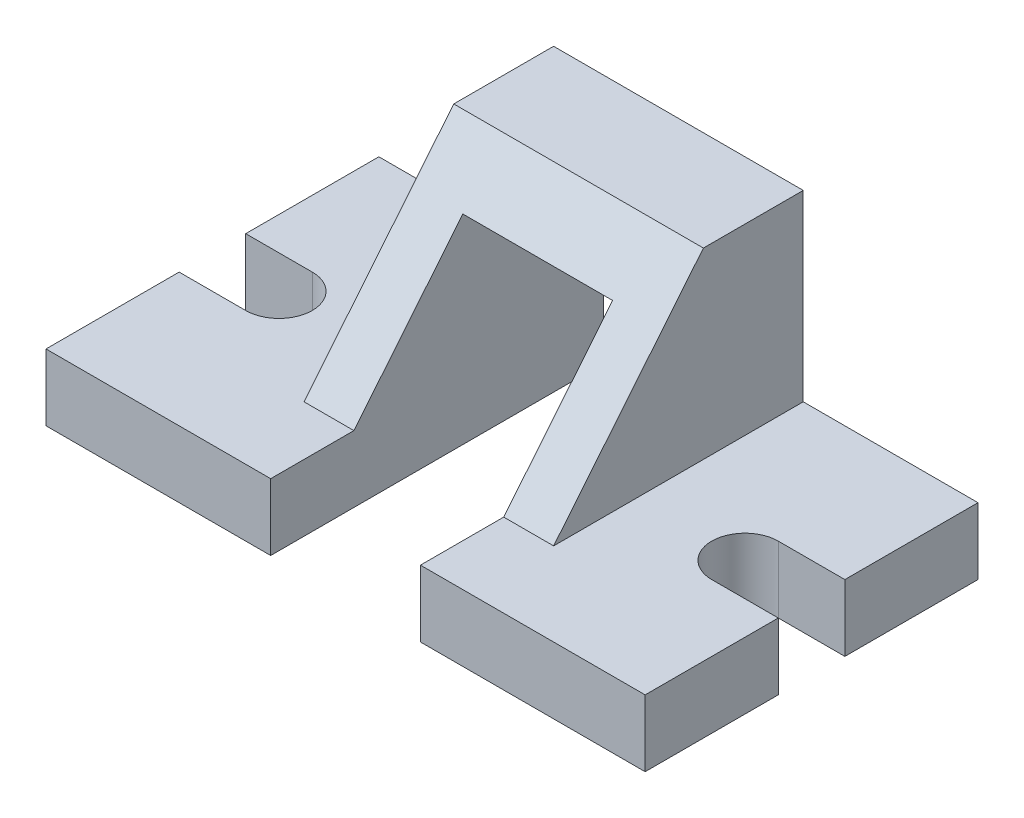
ISO-10303-21;
HEADER;
FILE_DESCRIPTION(('STEP AP214'),'2;1');
FILE_NAME('part.step','',(''),(''),'','','');
FILE_SCHEMA(('AUTOMOTIVE_DESIGN { 1 0 10303 214 1 1 1 1 }'));
ENDSEC;
DATA;
#1=APPLICATION_CONTEXT('core data for automotive mechanical design processes');
#2=APPLICATION_PROTOCOL_DEFINITION('international standard','automotive_design',2000,#1);
#3=PRODUCT_CONTEXT('',#1,'mechanical');
#4=PRODUCT('Part','Part','',(#3));
#5=PRODUCT_RELATED_PRODUCT_CATEGORY('part','',(#4));
#6=PRODUCT_DEFINITION_FORMATION('','',#4);
#7=PRODUCT_DEFINITION_CONTEXT('part definition',#1,'design');
#8=PRODUCT_DEFINITION('design','',#6,#7);
#9=PRODUCT_DEFINITION_SHAPE('','',#8);
#10=(LENGTH_UNIT() NAMED_UNIT(*) SI_UNIT(.MILLI.,.METRE.));
#11=(NAMED_UNIT(*) PLANE_ANGLE_UNIT() SI_UNIT($,.RADIAN.));
#12=(NAMED_UNIT(*) SI_UNIT($,.STERADIAN.) SOLID_ANGLE_UNIT());
#13=UNCERTAINTY_MEASURE_WITH_UNIT(LENGTH_MEASURE(1.E-05),#10,'distance_accuracy_value','');
#14=(GEOMETRIC_REPRESENTATION_CONTEXT(3) GLOBAL_UNCERTAINTY_ASSIGNED_CONTEXT((#13)) GLOBAL_UNIT_ASSIGNED_CONTEXT((#10,
#11,#12)) REPRESENTATION_CONTEXT('',''));
#15=CARTESIAN_POINT('',(0.,0.,0.));
#16=DIRECTION('',(0.,0.,1.));
#17=DIRECTION('',(1.,0.,0.));
#18=AXIS2_PLACEMENT_3D('',#15,#16,#17);
#19=CARTESIAN_POINT('',(0.,8.,0.));
#20=DIRECTION('',(0.,-1.,0.));
#21=DIRECTION('',(0.,0.,-1.));
#22=AXIS2_PLACEMENT_3D('',#19,#20,#21);
#23=PLANE('',#22);
#24=DIRECTION('',(-1.,0.,0.));
#25=VECTOR('',#24,1.);
#26=CARTESIAN_POINT('',(0.,8.,-4.));
#27=LINE('',#26,#25);
#28=CARTESIAN_POINT('',(-28.,8.,-4.));
#29=VERTEX_POINT('',#28);
#30=CARTESIAN_POINT('',(-36.,8.,-4.));
#31=VERTEX_POINT('',#30);
#32=EDGE_CURVE('E319',#29,#31,#27,.T.);
#33=ORIENTED_EDGE('',*,*,#32,.F.);
#34=CARTESIAN_POINT('',(-28.,8.,0.));
#35=DIRECTION('',(0.,-1.,0.));
#36=DIRECTION('',(0.,0.,-1.));
#37=AXIS2_PLACEMENT_3D('',#34,#35,#36);
#38=CIRCLE('',#37,4.);
#39=CARTESIAN_POINT('',(-28.,8.,4.));
#40=VERTEX_POINT('',#39);
#41=EDGE_CURVE('E206',#40,#29,#38,.F.);
#42=ORIENTED_EDGE('',*,*,#41,.F.);
#43=DIRECTION('',(1.,0.,0.));
#44=VECTOR('',#43,1.);
#45=CARTESIAN_POINT('',(0.,8.,4.));
#46=LINE('',#45,#44);
#47=CARTESIAN_POINT('',(-36.,8.,4.));
#48=VERTEX_POINT('',#47);
#49=EDGE_CURVE('E191',#48,#40,#46,.T.);
#50=ORIENTED_EDGE('',*,*,#49,.F.);
#51=DIRECTION('',(0.,0.,1.));
#52=VECTOR('',#51,1.);
#53=CARTESIAN_POINT('',(-36.,8.,20.));
#54=LINE('',#53,#52);
#55=CARTESIAN_POINT('',(-36.,8.,20.));
#56=VERTEX_POINT('',#55);
#57=EDGE_CURVE('E204',#48,#56,#54,.T.);
#58=ORIENTED_EDGE('',*,*,#57,.T.);
#59=DIRECTION('',(1.,0.,0.));
#60=VECTOR('',#59,1.);
#61=CARTESIAN_POINT('',(-36.,8.,20.));
#62=LINE('',#61,#60);
#63=CARTESIAN_POINT('',(-9.,8.,20.));
#64=VERTEX_POINT('',#63);
#65=EDGE_CURVE('E227',#56,#64,#62,.T.);
#66=ORIENTED_EDGE('',*,*,#65,.T.);
#67=DIRECTION('',(0.,0.,1.));
#68=VECTOR('',#67,1.);
#69=CARTESIAN_POINT('',(-9.,8.,0.));
#70=LINE('',#69,#68);
#71=CARTESIAN_POINT('',(-9.,8.,9.99647692346881));
#72=VERTEX_POINT('',#71);
#73=EDGE_CURVE('E363',#72,#64,#70,.T.);
#74=ORIENTED_EDGE('',*,*,#73,.F.);
#75=DIRECTION('',(-1.,0.,0.));
#76=VECTOR('',#75,1.);
#77=CARTESIAN_POINT('',(30.,8.,9.99647692346881));
#78=LINE('',#77,#76);
#79=CARTESIAN_POINT('',(-15.,8.,9.99647692346881));
#80=VERTEX_POINT('',#79);
#81=EDGE_CURVE('E372',#72,#80,#78,.T.);
#82=ORIENTED_EDGE('',*,*,#81,.T.);
#83=DIRECTION('',(0.,0.,1.));
#84=VECTOR('',#83,1.);
#85=CARTESIAN_POINT('',(-15.,8.,0.));
#86=LINE('',#85,#84);
#87=CARTESIAN_POINT('',(-15.,8.,-20.));
#88=VERTEX_POINT('',#87);
#89=EDGE_CURVE('E402',#88,#80,#86,.T.);
#90=ORIENTED_EDGE('',*,*,#89,.F.);
#91=DIRECTION('',(-1.,0.,0.));
#92=VECTOR('',#91,1.);
#93=CARTESIAN_POINT('',(-36.,8.,-20.));
#94=LINE('',#93,#92);
#95=CARTESIAN_POINT('',(-36.,8.,-20.));
#96=VERTEX_POINT('',#95);
#97=EDGE_CURVE('E223',#88,#96,#94,.T.);
#98=ORIENTED_EDGE('',*,*,#97,.T.);
#99=EDGE_CURVE('E215',#96,#31,#54,.T.);
#100=ORIENTED_EDGE('',*,*,#99,.T.);
#101=EDGE_LOOP('',(#33,#42,#50,#58,#66,#74,#82,#90,#98,#100));
#102=FACE_BOUND('',#101,.T.);
#103=ADVANCED_FACE('F39',(#102),#23,.F.);
#104=DIRECTION('',(1.,0.,0.));
#105=VECTOR('',#104,1.);
#106=CARTESIAN_POINT('',(0.,8.,4.));
#107=LINE('',#106,#105);
#108=CARTESIAN_POINT('',(28.,8.,4.));
#109=VERTEX_POINT('',#108);
#110=CARTESIAN_POINT('',(36.,8.,4.));
#111=VERTEX_POINT('',#110);
#112=EDGE_CURVE('E328',#109,#111,#107,.T.);
#113=ORIENTED_EDGE('',*,*,#112,.F.);
#114=CARTESIAN_POINT('',(28.,8.,0.));
#115=DIRECTION('',(0.,-1.,0.));
#116=DIRECTION('',(0.,0.,-1.));
#117=AXIS2_PLACEMENT_3D('',#114,#115,#116);
#118=CIRCLE('',#117,4.);
#119=CARTESIAN_POINT('',(28.,8.,-4.));
#120=VERTEX_POINT('',#119);
#121=EDGE_CURVE('E331',#120,#109,#118,.F.);
#122=ORIENTED_EDGE('',*,*,#121,.F.);
#123=DIRECTION('',(-1.,0.,0.));
#124=VECTOR('',#123,1.);
#125=CARTESIAN_POINT('',(0.,8.,-4.00000000000001));
#126=LINE('',#125,#124);
#127=CARTESIAN_POINT('',(36.,8.,-4.));
#128=VERTEX_POINT('',#127);
#129=EDGE_CURVE('E304',#128,#120,#126,.T.);
#130=ORIENTED_EDGE('',*,*,#129,.F.);
#131=DIRECTION('',(0.,0.,-1.));
#132=VECTOR('',#131,1.);
#133=CARTESIAN_POINT('',(36.,8.,20.));
#134=LINE('',#133,#132);
#135=CARTESIAN_POINT('',(36.,8.,-20.));
#136=VERTEX_POINT('',#135);
#137=EDGE_CURVE('E251',#128,#136,#134,.T.);
#138=ORIENTED_EDGE('',*,*,#137,.T.);
#139=CARTESIAN_POINT('',(15.,8.,-20.));
#140=VERTEX_POINT('',#139);
#141=EDGE_CURVE('E216',#136,#140,#94,.T.);
#142=ORIENTED_EDGE('',*,*,#141,.T.);
#143=DIRECTION('',(0.,0.,-1.));
#144=VECTOR('',#143,1.);
#145=CARTESIAN_POINT('',(15.,8.,0.));
#146=LINE('',#145,#144);
#147=CARTESIAN_POINT('',(15.,8.,9.99647692346881));
#148=VERTEX_POINT('',#147);
#149=EDGE_CURVE('E406',#148,#140,#146,.T.);
#150=ORIENTED_EDGE('',*,*,#149,.F.);
#151=CARTESIAN_POINT('',(9.,8.,9.99647692346881));
#152=VERTEX_POINT('',#151);
#153=EDGE_CURVE('E373',#148,#152,#78,.T.);
#154=ORIENTED_EDGE('',*,*,#153,.T.);
#155=DIRECTION('',(0.,0.,-1.));
#156=VECTOR('',#155,1.);
#157=CARTESIAN_POINT('',(9.,8.,0.));
#158=LINE('',#157,#156);
#159=CARTESIAN_POINT('',(9.,8.,20.));
#160=VERTEX_POINT('',#159);
#161=EDGE_CURVE('E354',#160,#152,#158,.T.);
#162=ORIENTED_EDGE('',*,*,#161,.F.);
#163=CARTESIAN_POINT('',(36.,8.,20.));
#164=VERTEX_POINT('',#163);
#165=EDGE_CURVE('E221',#160,#164,#62,.T.);
#166=ORIENTED_EDGE('',*,*,#165,.T.);
#167=EDGE_CURVE('E408',#164,#111,#134,.T.);
#168=ORIENTED_EDGE('',*,*,#167,.T.);
#169=EDGE_LOOP('',(#113,#122,#130,#138,#142,#150,#154,#162,#166,#168));
#170=FACE_BOUND('',#169,.T.);
#171=ADVANCED_FACE('F418',(#170),#23,.F.);
#172=CARTESIAN_POINT('',(0.,0.,0.));
#173=DIRECTION('',(0.,-1.,0.));
#174=DIRECTION('',(0.,0.,-1.));
#175=AXIS2_PLACEMENT_3D('',#172,#173,#174);
#176=PLANE('',#175);
#177=CARTESIAN_POINT('',(-28.,0.,0.));
#178=DIRECTION('',(0.,-1.,0.));
#179=DIRECTION('',(0.,0.,-1.));
#180=AXIS2_PLACEMENT_3D('',#177,#178,#179);
#181=CIRCLE('',#180,4.);
#182=CARTESIAN_POINT('',(-28.,0.,4.));
#183=VERTEX_POINT('',#182);
#184=CARTESIAN_POINT('',(-28.,0.,-4.));
#185=VERTEX_POINT('',#184);
#186=EDGE_CURVE('E11',#183,#185,#181,.F.);
#187=ORIENTED_EDGE('',*,*,#186,.T.);
#188=DIRECTION('',(-1.,0.,0.));
#189=VECTOR('',#188,1.);
#190=CARTESIAN_POINT('',(0.,0.,-4.));
#191=LINE('',#190,#189);
#192=CARTESIAN_POINT('',(-36.,0.,-4.));
#193=VERTEX_POINT('',#192);
#194=EDGE_CURVE('E208',#185,#193,#191,.T.);
#195=ORIENTED_EDGE('',*,*,#194,.T.);
#196=DIRECTION('',(0.,0.,1.));
#197=VECTOR('',#196,1.);
#198=CARTESIAN_POINT('',(-36.,0.,20.));
#199=LINE('',#198,#197);
#200=CARTESIAN_POINT('',(-36.,0.,-20.));
#201=VERTEX_POINT('',#200);
#202=EDGE_CURVE('E242',#201,#193,#199,.T.);
#203=ORIENTED_EDGE('',*,*,#202,.F.);
#204=DIRECTION('',(-1.,0.,0.));
#205=VECTOR('',#204,1.);
#206=CARTESIAN_POINT('',(-36.,0.,-20.));
#207=LINE('',#206,#205);
#208=CARTESIAN_POINT('',(-9.,0.,-20.));
#209=VERTEX_POINT('',#208);
#210=EDGE_CURVE('E235',#209,#201,#207,.T.);
#211=ORIENTED_EDGE('',*,*,#210,.F.);
#212=DIRECTION('',(0.,0.,-1.));
#213=VECTOR('',#212,1.);
#214=CARTESIAN_POINT('',(-9.,0.,30.));
#215=LINE('',#214,#213);
#216=CARTESIAN_POINT('',(-9.,0.,20.));
#217=VERTEX_POINT('',#216);
#218=EDGE_CURVE('E348',#217,#209,#215,.T.);
#219=ORIENTED_EDGE('',*,*,#218,.F.);
#220=DIRECTION('',(1.,0.,0.));
#221=VECTOR('',#220,1.);
#222=CARTESIAN_POINT('',(-36.,0.,20.));
#223=LINE('',#222,#221);
#224=CARTESIAN_POINT('',(-36.,0.,20.));
#225=VERTEX_POINT('',#224);
#226=EDGE_CURVE('E247',#225,#217,#223,.T.);
#227=ORIENTED_EDGE('',*,*,#226,.F.);
#228=CARTESIAN_POINT('',(-36.,0.,4.));
#229=VERTEX_POINT('',#228);
#230=EDGE_CURVE('E241',#229,#225,#199,.T.);
#231=ORIENTED_EDGE('',*,*,#230,.F.);
#232=DIRECTION('',(1.,0.,0.));
#233=VECTOR('',#232,1.);
#234=CARTESIAN_POINT('',(0.,0.,4.));
#235=LINE('',#234,#233);
#236=EDGE_CURVE('E63',#229,#183,#235,.T.);
#237=ORIENTED_EDGE('',*,*,#236,.T.);
#238=EDGE_LOOP('',(#187,#195,#203,#211,#219,#227,#231,#237));
#239=FACE_BOUND('',#238,.T.);
#240=ADVANCED_FACE('F453',(#239),#176,.T.);
#241=CARTESIAN_POINT('',(28.,0.,0.));
#242=DIRECTION('',(0.,-1.,0.));
#243=DIRECTION('',(0.,0.,-1.));
#244=AXIS2_PLACEMENT_3D('',#241,#242,#243);
#245=CIRCLE('',#244,4.);
#246=CARTESIAN_POINT('',(28.,0.,-4.));
#247=VERTEX_POINT('',#246);
#248=CARTESIAN_POINT('',(28.,0.,4.));
#249=VERTEX_POINT('',#248);
#250=EDGE_CURVE('E48',#247,#249,#245,.F.);
#251=ORIENTED_EDGE('',*,*,#250,.T.);
#252=DIRECTION('',(1.,0.,0.));
#253=VECTOR('',#252,1.);
#254=CARTESIAN_POINT('',(0.,0.,4.));
#255=LINE('',#254,#253);
#256=CARTESIAN_POINT('',(36.,0.,4.));
#257=VERTEX_POINT('',#256);
#258=EDGE_CURVE('E292',#249,#257,#255,.T.);
#259=ORIENTED_EDGE('',*,*,#258,.T.);
#260=DIRECTION('',(0.,0.,-1.));
#261=VECTOR('',#260,1.);
#262=CARTESIAN_POINT('',(36.,0.,20.));
#263=LINE('',#262,#261);
#264=CARTESIAN_POINT('',(36.,0.,20.));
#265=VERTEX_POINT('',#264);
#266=EDGE_CURVE('E231',#265,#257,#263,.T.);
#267=ORIENTED_EDGE('',*,*,#266,.F.);
#268=CARTESIAN_POINT('',(9.,0.,20.));
#269=VERTEX_POINT('',#268);
#270=EDGE_CURVE('E246',#269,#265,#223,.T.);
#271=ORIENTED_EDGE('',*,*,#270,.F.);
#272=DIRECTION('',(0.,0.,-1.));
#273=VECTOR('',#272,1.);
#274=CARTESIAN_POINT('',(9.,0.,30.));
#275=LINE('',#274,#273);
#276=CARTESIAN_POINT('',(9.,0.,-20.));
#277=VERTEX_POINT('',#276);
#278=EDGE_CURVE('E344',#269,#277,#275,.T.);
#279=ORIENTED_EDGE('',*,*,#278,.T.);
#280=CARTESIAN_POINT('',(36.,0.,-20.));
#281=VERTEX_POINT('',#280);
#282=EDGE_CURVE('E237',#281,#277,#207,.T.);
#283=ORIENTED_EDGE('',*,*,#282,.F.);
#284=CARTESIAN_POINT('',(36.,0.,-4.));
#285=VERTEX_POINT('',#284);
#286=EDGE_CURVE('E236',#285,#281,#263,.T.);
#287=ORIENTED_EDGE('',*,*,#286,.F.);
#288=DIRECTION('',(-1.,0.,0.));
#289=VECTOR('',#288,1.);
#290=CARTESIAN_POINT('',(0.,0.,-4.00000000000001));
#291=LINE('',#290,#289);
#292=EDGE_CURVE('E55',#285,#247,#291,.T.);
#293=ORIENTED_EDGE('',*,*,#292,.T.);
#294=EDGE_LOOP('',(#251,#259,#267,#271,#279,#283,#287,#293));
#295=FACE_BOUND('',#294,.T.);
#296=ADVANCED_FACE('F290',(#295),#176,.T.);
#297=CARTESIAN_POINT('',(36.,8.,20.));
#298=DIRECTION('',(-1.,0.,0.));
#299=DIRECTION('',(0.,0.,1.));
#300=AXIS2_PLACEMENT_3D('',#297,#298,#299);
#301=PLANE('',#300);
#302=DIRECTION('',(0.,-1.,0.));
#303=VECTOR('',#302,1.);
#304=CARTESIAN_POINT('',(36.,8.,4.));
#305=LINE('',#304,#303);
#306=EDGE_CURVE('E284',#111,#257,#305,.T.);
#307=ORIENTED_EDGE('',*,*,#306,.F.);
#308=ORIENTED_EDGE('',*,*,#167,.F.);
#309=DIRECTION('',(0.,-1.,0.));
#310=VECTOR('',#309,1.);
#311=CARTESIAN_POINT('',(36.,8.,20.));
#312=LINE('',#311,#310);
#313=EDGE_CURVE('E230',#164,#265,#312,.T.);
#314=ORIENTED_EDGE('',*,*,#313,.T.);
#315=ORIENTED_EDGE('',*,*,#266,.T.);
#316=EDGE_LOOP('',(#307,#308,#314,#315));
#317=FACE_BOUND('',#316,.T.);
#318=ADVANCED_FACE('F41',(#317),#301,.F.);
#319=DIRECTION('',(0.,1.,0.));
#320=VECTOR('',#319,1.);
#321=CARTESIAN_POINT('',(36.,8.,-4.));
#322=LINE('',#321,#320);
#323=EDGE_CURVE('E281',#285,#128,#322,.T.);
#324=ORIENTED_EDGE('',*,*,#323,.F.);
#325=ORIENTED_EDGE('',*,*,#286,.T.);
#326=DIRECTION('',(0.,-1.,0.));
#327=VECTOR('',#326,1.);
#328=CARTESIAN_POINT('',(36.,8.,-20.));
#329=LINE('',#328,#327);
#330=EDGE_CURVE('E261',#136,#281,#329,.T.);
#331=ORIENTED_EDGE('',*,*,#330,.F.);
#332=ORIENTED_EDGE('',*,*,#137,.F.);
#333=EDGE_LOOP('',(#324,#325,#331,#332));
#334=FACE_BOUND('',#333,.T.);
#335=ADVANCED_FACE('F427',(#334),#301,.F.);
#336=CARTESIAN_POINT('',(-36.,8.,20.));
#337=DIRECTION('',(1.,0.,0.));
#338=DIRECTION('',(0.,0.,-1.));
#339=AXIS2_PLACEMENT_3D('',#336,#337,#338);
#340=PLANE('',#339);
#341=DIRECTION('',(0.,-1.,0.));
#342=VECTOR('',#341,1.);
#343=CARTESIAN_POINT('',(-36.,8.,-4.));
#344=LINE('',#343,#342);
#345=EDGE_CURVE('E197',#31,#193,#344,.T.);
#346=ORIENTED_EDGE('',*,*,#345,.F.);
#347=ORIENTED_EDGE('',*,*,#99,.F.);
#348=DIRECTION('',(0.,-1.,0.));
#349=VECTOR('',#348,1.);
#350=CARTESIAN_POINT('',(-36.,8.,-20.));
#351=LINE('',#350,#349);
#352=EDGE_CURVE('E257',#96,#201,#351,.T.);
#353=ORIENTED_EDGE('',*,*,#352,.T.);
#354=ORIENTED_EDGE('',*,*,#202,.T.);
#355=EDGE_LOOP('',(#346,#347,#353,#354));
#356=FACE_BOUND('',#355,.T.);
#357=ADVANCED_FACE('F466',(#356),#340,.F.);
#358=DIRECTION('',(0.,1.,0.));
#359=VECTOR('',#358,1.);
#360=CARTESIAN_POINT('',(-36.,8.,4.));
#361=LINE('',#360,#359);
#362=EDGE_CURVE('E188',#229,#48,#361,.T.);
#363=ORIENTED_EDGE('',*,*,#362,.F.);
#364=ORIENTED_EDGE('',*,*,#230,.T.);
#365=DIRECTION('',(0.,-1.,0.));
#366=VECTOR('',#365,1.);
#367=CARTESIAN_POINT('',(-36.,8.,20.));
#368=LINE('',#367,#366);
#369=EDGE_CURVE('E212',#56,#225,#368,.T.);
#370=ORIENTED_EDGE('',*,*,#369,.F.);
#371=ORIENTED_EDGE('',*,*,#57,.F.);
#372=EDGE_LOOP('',(#363,#364,#370,#371));
#373=FACE_BOUND('',#372,.T.);
#374=ADVANCED_FACE('F210',(#373),#340,.F.);
#375=CARTESIAN_POINT('',(-36.,8.,20.));
#376=DIRECTION('',(0.,0.,-1.));
#377=DIRECTION('',(-1.,0.,0.));
#378=AXIS2_PLACEMENT_3D('',#375,#376,#377);
#379=PLANE('',#378);
#380=DIRECTION('',(0.,-1.,0.));
#381=VECTOR('',#380,1.);
#382=CARTESIAN_POINT('',(-9.,8.,20.));
#383=LINE('',#382,#381);
#384=EDGE_CURVE('E366',#64,#217,#383,.T.);
#385=ORIENTED_EDGE('',*,*,#384,.F.);
#386=ORIENTED_EDGE('',*,*,#65,.F.);
#387=ORIENTED_EDGE('',*,*,#369,.T.);
#388=ORIENTED_EDGE('',*,*,#226,.T.);
#389=EDGE_LOOP('',(#385,#386,#387,#388));
#390=FACE_BOUND('',#389,.T.);
#391=ADVANCED_FACE('F491',(#390),#379,.F.);
#392=DIRECTION('',(0.,1.,0.));
#393=VECTOR('',#392,1.);
#394=CARTESIAN_POINT('',(9.,8.,20.));
#395=LINE('',#394,#393);
#396=EDGE_CURVE('E357',#269,#160,#395,.T.);
#397=ORIENTED_EDGE('',*,*,#396,.F.);
#398=ORIENTED_EDGE('',*,*,#270,.T.);
#399=ORIENTED_EDGE('',*,*,#313,.F.);
#400=ORIENTED_EDGE('',*,*,#165,.F.);
#401=EDGE_LOOP('',(#397,#398,#399,#400));
#402=FACE_BOUND('',#401,.T.);
#403=ADVANCED_FACE('F494',(#402),#379,.F.);
#404=CARTESIAN_POINT('',(-36.,8.,-20.));
#405=DIRECTION('',(0.,0.,1.));
#406=DIRECTION('',(1.,0.,0.));
#407=AXIS2_PLACEMENT_3D('',#404,#405,#406);
#408=PLANE('',#407);
#409=DIRECTION('',(0.,1.,0.));
#410=VECTOR('',#409,1.);
#411=CARTESIAN_POINT('',(-9.,8.,-20.));
#412=LINE('',#411,#410);
#413=CARTESIAN_POINT('',(-9.,24.,-20.));
#414=VERTEX_POINT('',#413);
#415=EDGE_CURVE('E369',#209,#414,#412,.T.);
#416=ORIENTED_EDGE('',*,*,#415,.F.);
#417=ORIENTED_EDGE('',*,*,#210,.T.);
#418=ORIENTED_EDGE('',*,*,#352,.F.);
#419=ORIENTED_EDGE('',*,*,#97,.F.);
#420=DIRECTION('',(0.,-1.,0.));
#421=VECTOR('',#420,1.);
#422=CARTESIAN_POINT('',(-15.,30.,-20.));
#423=LINE('',#422,#421);
#424=CARTESIAN_POINT('',(-15.,30.,-20.));
#425=VERTEX_POINT('',#424);
#426=EDGE_CURVE('E394',#425,#88,#423,.T.);
#427=ORIENTED_EDGE('',*,*,#426,.F.);
#428=DIRECTION('',(-1.,0.,0.));
#429=VECTOR('',#428,1.);
#430=CARTESIAN_POINT('',(-15.,30.,-20.));
#431=LINE('',#430,#429);
#432=CARTESIAN_POINT('',(15.,30.,-20.));
#433=VERTEX_POINT('',#432);
#434=EDGE_CURVE('E387',#433,#425,#431,.T.);
#435=ORIENTED_EDGE('',*,*,#434,.F.);
#436=DIRECTION('',(0.,-1.,0.));
#437=VECTOR('',#436,1.);
#438=CARTESIAN_POINT('',(15.,30.,-20.));
#439=LINE('',#438,#437);
#440=EDGE_CURVE('E398',#433,#140,#439,.T.);
#441=ORIENTED_EDGE('',*,*,#440,.T.);
#442=ORIENTED_EDGE('',*,*,#141,.F.);
#443=ORIENTED_EDGE('',*,*,#330,.T.);
#444=ORIENTED_EDGE('',*,*,#282,.T.);
#445=DIRECTION('',(0.,-1.,0.));
#446=VECTOR('',#445,1.);
#447=CARTESIAN_POINT('',(9.,8.,-20.));
#448=LINE('',#447,#446);
#449=CARTESIAN_POINT('',(9.,24.,-20.));
#450=VERTEX_POINT('',#449);
#451=EDGE_CURVE('E360',#450,#277,#448,.T.);
#452=ORIENTED_EDGE('',*,*,#451,.F.);
#453=DIRECTION('',(1.,0.,0.));
#454=VECTOR('',#453,1.);
#455=CARTESIAN_POINT('',(-36.,24.,-20.));
#456=LINE('',#455,#454);
#457=EDGE_CURVE('E351',#414,#450,#456,.T.);
#458=ORIENTED_EDGE('',*,*,#457,.F.);
#459=EDGE_LOOP('',(#416,#417,#418,#419,#427,#435,#441,#442,#443,#444,#452,#458));
#460=FACE_BOUND('',#459,.T.);
#461=ADVANCED_FACE('F424',(#460),#408,.F.);
#462=CARTESIAN_POINT('',(30.,8.,9.99647692346881));
#463=DIRECTION('',(0.,0.633163539390759,0.774018043966784));
#464=DIRECTION('',(0.,-0.774018043966784,0.633163539390759));
#465=AXIS2_PLACEMENT_3D('',#462,#463,#464);
#466=PLANE('',#465);
#467=ORIENTED_EDGE('',*,*,#81,.F.);
#468=DIRECTION('',(0.,0.774018043966784,-0.633163539390759));
#469=VECTOR('',#468,1.);
#470=CARTESIAN_POINT('',(-9.,8.,9.99647692346881));
#471=LINE('',#470,#469);
#472=CARTESIAN_POINT('',(-9.,24.,-3.09186992996305));
#473=VERTEX_POINT('',#472);
#474=EDGE_CURVE('E198',#72,#473,#471,.T.);
#475=ORIENTED_EDGE('',*,*,#474,.T.);
#476=DIRECTION('',(1.,0.,0.));
#477=VECTOR('',#476,1.);
#478=CARTESIAN_POINT('',(30.,24.,-3.09186992996305));
#479=LINE('',#478,#477);
#480=CARTESIAN_POINT('',(9.,24.,-3.09186992996305));
#481=VERTEX_POINT('',#480);
#482=EDGE_CURVE('E268',#473,#481,#479,.T.);
#483=ORIENTED_EDGE('',*,*,#482,.T.);
#484=DIRECTION('',(0.,-0.774018043966784,0.633163539390759));
#485=VECTOR('',#484,1.);
#486=CARTESIAN_POINT('',(9.,8.,9.99647692346881));
#487=LINE('',#486,#485);
#488=EDGE_CURVE('E272',#481,#152,#487,.T.);
#489=ORIENTED_EDGE('',*,*,#488,.T.);
#490=ORIENTED_EDGE('',*,*,#153,.F.);
#491=DIRECTION('',(0.,0.774018043966784,-0.633163539390759));
#492=VECTOR('',#491,1.);
#493=CARTESIAN_POINT('',(15.,16.277759880431,3.22508989318734));
#494=LINE('',#493,#492);
#495=CARTESIAN_POINT('',(15.,30.,-8.));
#496=VERTEX_POINT('',#495);
#497=EDGE_CURVE('E381',#148,#496,#494,.T.);
#498=ORIENTED_EDGE('',*,*,#497,.T.);
#499=DIRECTION('',(-1.,0.,0.));
#500=VECTOR('',#499,1.);
#501=CARTESIAN_POINT('',(0.,30.,-8.));
#502=LINE('',#501,#500);
#503=CARTESIAN_POINT('',(-15.,30.,-8.));
#504=VERTEX_POINT('',#503);
#505=EDGE_CURVE('E265',#496,#504,#502,.T.);
#506=ORIENTED_EDGE('',*,*,#505,.T.);
#507=DIRECTION('',(0.,-0.774018043966784,0.633163539390759));
#508=VECTOR('',#507,1.);
#509=CARTESIAN_POINT('',(-15.,16.277759880431,3.22508989318734));
#510=LINE('',#509,#508);
#511=EDGE_CURVE('E377',#504,#80,#510,.T.);
#512=ORIENTED_EDGE('',*,*,#511,.T.);
#513=EDGE_LOOP('',(#467,#475,#483,#489,#490,#498,#506,#512));
#514=FACE_BOUND('',#513,.T.);
#515=ADVANCED_FACE('F445',(#514),#466,.T.);
#516=CARTESIAN_POINT('',(15.,30.,20.));
#517=DIRECTION('',(-1.,0.,0.));
#518=DIRECTION('',(0.,0.,1.));
#519=AXIS2_PLACEMENT_3D('',#516,#517,#518);
#520=PLANE('',#519);
#521=ORIENTED_EDGE('',*,*,#497,.F.);
#522=ORIENTED_EDGE('',*,*,#149,.T.);
#523=ORIENTED_EDGE('',*,*,#440,.F.);
#524=DIRECTION('',(0.,0.,-1.));
#525=VECTOR('',#524,1.);
#526=CARTESIAN_POINT('',(15.,30.,20.));
#527=LINE('',#526,#525);
#528=EDGE_CURVE('E384',#496,#433,#527,.T.);
#529=ORIENTED_EDGE('',*,*,#528,.F.);
#530=EDGE_LOOP('',(#521,#522,#523,#529));
#531=FACE_BOUND('',#530,.T.);
#532=ADVANCED_FACE('F487',(#531),#520,.F.);
#533=CARTESIAN_POINT('',(-15.,30.,20.));
#534=DIRECTION('',(1.,0.,0.));
#535=DIRECTION('',(0.,0.,-1.));
#536=AXIS2_PLACEMENT_3D('',#533,#534,#535);
#537=PLANE('',#536);
#538=ORIENTED_EDGE('',*,*,#511,.F.);
#539=DIRECTION('',(0.,0.,1.));
#540=VECTOR('',#539,1.);
#541=CARTESIAN_POINT('',(-15.,30.,20.));
#542=LINE('',#541,#540);
#543=EDGE_CURVE('E390',#425,#504,#542,.T.);
#544=ORIENTED_EDGE('',*,*,#543,.F.);
#545=ORIENTED_EDGE('',*,*,#426,.T.);
#546=ORIENTED_EDGE('',*,*,#89,.T.);
#547=EDGE_LOOP('',(#538,#544,#545,#546));
#548=FACE_BOUND('',#547,.T.);
#549=ADVANCED_FACE('F527',(#548),#537,.F.);
#550=CARTESIAN_POINT('',(0.,30.,0.));
#551=DIRECTION('',(0.,-1.,0.));
#552=DIRECTION('',(0.,0.,-1.));
#553=AXIS2_PLACEMENT_3D('',#550,#551,#552);
#554=PLANE('',#553);
#555=ORIENTED_EDGE('',*,*,#505,.F.);
#556=ORIENTED_EDGE('',*,*,#528,.T.);
#557=ORIENTED_EDGE('',*,*,#434,.T.);
#558=ORIENTED_EDGE('',*,*,#543,.T.);
#559=EDGE_LOOP('',(#555,#556,#557,#558));
#560=FACE_BOUND('',#559,.T.);
#561=ADVANCED_FACE('F524',(#560),#554,.F.);
#562=CARTESIAN_POINT('',(-9.,0.,30.));
#563=DIRECTION('',(1.,0.,0.));
#564=DIRECTION('',(0.,0.,-1.));
#565=AXIS2_PLACEMENT_3D('',#562,#563,#564);
#566=PLANE('',#565);
#567=ORIENTED_EDGE('',*,*,#415,.T.);
#568=DIRECTION('',(0.,0.,-1.));
#569=VECTOR('',#568,1.);
#570=CARTESIAN_POINT('',(-9.,24.,30.));
#571=LINE('',#570,#569);
#572=EDGE_CURVE('E336',#473,#414,#571,.T.);
#573=ORIENTED_EDGE('',*,*,#572,.F.);
#574=ORIENTED_EDGE('',*,*,#474,.F.);
#575=ORIENTED_EDGE('',*,*,#73,.T.);
#576=ORIENTED_EDGE('',*,*,#384,.T.);
#577=ORIENTED_EDGE('',*,*,#218,.T.);
#578=EDGE_LOOP('',(#567,#573,#574,#575,#576,#577));
#579=FACE_BOUND('',#578,.T.);
#580=ADVANCED_FACE('F441',(#579),#566,.T.);
#581=CARTESIAN_POINT('',(9.,0.,30.));
#582=DIRECTION('',(-1.,0.,0.));
#583=DIRECTION('',(0.,0.,1.));
#584=AXIS2_PLACEMENT_3D('',#581,#582,#583);
#585=PLANE('',#584);
#586=ORIENTED_EDGE('',*,*,#451,.T.);
#587=ORIENTED_EDGE('',*,*,#278,.F.);
#588=ORIENTED_EDGE('',*,*,#396,.T.);
#589=ORIENTED_EDGE('',*,*,#161,.T.);
#590=ORIENTED_EDGE('',*,*,#488,.F.);
#591=DIRECTION('',(0.,0.,-1.));
#592=VECTOR('',#591,1.);
#593=CARTESIAN_POINT('',(9.,24.,30.));
#594=LINE('',#593,#592);
#595=EDGE_CURVE('E340',#481,#450,#594,.T.);
#596=ORIENTED_EDGE('',*,*,#595,.T.);
#597=EDGE_LOOP('',(#586,#587,#588,#589,#590,#596));
#598=FACE_BOUND('',#597,.T.);
#599=ADVANCED_FACE('F434',(#598),#585,.T.);
#600=CARTESIAN_POINT('',(-9.,24.,30.));
#601=DIRECTION('',(0.,-1.,0.));
#602=DIRECTION('',(0.,0.,-1.));
#603=AXIS2_PLACEMENT_3D('',#600,#601,#602);
#604=PLANE('',#603);
#605=ORIENTED_EDGE('',*,*,#457,.T.);
#606=ORIENTED_EDGE('',*,*,#595,.F.);
#607=ORIENTED_EDGE('',*,*,#482,.F.);
#608=ORIENTED_EDGE('',*,*,#572,.T.);
#609=EDGE_LOOP('',(#605,#606,#607,#608));
#610=FACE_BOUND('',#609,.T.);
#611=ADVANCED_FACE('F438',(#610),#604,.T.);
#612=CARTESIAN_POINT('',(-28.,30.,0.));
#613=DIRECTION('',(0.,-1.,0.));
#614=DIRECTION('',(0.,0.,-1.));
#615=AXIS2_PLACEMENT_3D('',#612,#613,#614);
#616=CYLINDRICAL_SURFACE('',#615,4.);
#617=ORIENTED_EDGE('',*,*,#41,.T.);
#618=DIRECTION('',(0.,-1.,0.));
#619=VECTOR('',#618,1.);
#620=CARTESIAN_POINT('',(-28.,30.,-4.));
#621=LINE('',#620,#619);
#622=EDGE_CURVE('E311',#29,#185,#621,.T.);
#623=ORIENTED_EDGE('',*,*,#622,.T.);
#624=ORIENTED_EDGE('',*,*,#186,.F.);
#625=DIRECTION('',(0.,-1.,0.));
#626=VECTOR('',#625,1.);
#627=CARTESIAN_POINT('',(-28.,30.,4.));
#628=LINE('',#627,#626);
#629=EDGE_CURVE('E308',#40,#183,#628,.T.);
#630=ORIENTED_EDGE('',*,*,#629,.F.);
#631=EDGE_LOOP('',(#617,#623,#624,#630));
#632=FACE_BOUND('',#631,.T.);
#633=ADVANCED_FACE('F470',(#632),#616,.F.);
#634=CARTESIAN_POINT('',(-28.,30.,-4.));
#635=DIRECTION('',(0.,0.,1.));
#636=DIRECTION('',(1.,0.,0.));
#637=AXIS2_PLACEMENT_3D('',#634,#635,#636);
#638=PLANE('',#637);
#639=ORIENTED_EDGE('',*,*,#32,.T.);
#640=ORIENTED_EDGE('',*,*,#345,.T.);
#641=ORIENTED_EDGE('',*,*,#194,.F.);
#642=ORIENTED_EDGE('',*,*,#622,.F.);
#643=EDGE_LOOP('',(#639,#640,#641,#642));
#644=FACE_BOUND('',#643,.T.);
#645=ADVANCED_FACE('F469',(#644),#638,.T.);
#646=CARTESIAN_POINT('',(-36.,30.,4.));
#647=DIRECTION('',(0.,0.,-1.));
#648=DIRECTION('',(-1.,0.,0.));
#649=AXIS2_PLACEMENT_3D('',#646,#647,#648);
#650=PLANE('',#649);
#651=ORIENTED_EDGE('',*,*,#49,.T.);
#652=ORIENTED_EDGE('',*,*,#629,.T.);
#653=ORIENTED_EDGE('',*,*,#236,.F.);
#654=ORIENTED_EDGE('',*,*,#362,.T.);
#655=EDGE_LOOP('',(#651,#652,#653,#654));
#656=FACE_BOUND('',#655,.T.);
#657=ADVANCED_FACE('F190',(#656),#650,.T.);
#658=CARTESIAN_POINT('',(28.,30.,0.));
#659=DIRECTION('',(0.,-1.,0.));
#660=DIRECTION('',(0.,0.,-1.));
#661=AXIS2_PLACEMENT_3D('',#658,#659,#660);
#662=CYLINDRICAL_SURFACE('',#661,4.);
#663=ORIENTED_EDGE('',*,*,#121,.T.);
#664=DIRECTION('',(0.,-1.,0.));
#665=VECTOR('',#664,1.);
#666=CARTESIAN_POINT('',(28.,30.,4.));
#667=LINE('',#666,#665);
#668=EDGE_CURVE('E301',#109,#249,#667,.T.);
#669=ORIENTED_EDGE('',*,*,#668,.T.);
#670=ORIENTED_EDGE('',*,*,#250,.F.);
#671=DIRECTION('',(0.,-1.,0.));
#672=VECTOR('',#671,1.);
#673=CARTESIAN_POINT('',(28.,30.,-4.));
#674=LINE('',#673,#672);
#675=EDGE_CURVE('E298',#120,#247,#674,.T.);
#676=ORIENTED_EDGE('',*,*,#675,.F.);
#677=EDGE_LOOP('',(#663,#669,#670,#676));
#678=FACE_BOUND('',#677,.T.);
#679=ADVANCED_FACE('F297',(#678),#662,.F.);
#680=CARTESIAN_POINT('',(36.,30.,4.));
#681=DIRECTION('',(0.,0.,-1.));
#682=DIRECTION('',(-1.,0.,0.));
#683=AXIS2_PLACEMENT_3D('',#680,#681,#682);
#684=PLANE('',#683);
#685=ORIENTED_EDGE('',*,*,#112,.T.);
#686=ORIENTED_EDGE('',*,*,#306,.T.);
#687=ORIENTED_EDGE('',*,*,#258,.F.);
#688=ORIENTED_EDGE('',*,*,#668,.F.);
#689=EDGE_LOOP('',(#685,#686,#687,#688));
#690=FACE_BOUND('',#689,.T.);
#691=ADVANCED_FACE('F512',(#690),#684,.T.);
#692=CARTESIAN_POINT('',(28.,30.,-4.));
#693=DIRECTION('',(0.,0.,1.));
#694=DIRECTION('',(1.,0.,0.));
#695=AXIS2_PLACEMENT_3D('',#692,#693,#694);
#696=PLANE('',#695);
#697=ORIENTED_EDGE('',*,*,#129,.T.);
#698=ORIENTED_EDGE('',*,*,#675,.T.);
#699=ORIENTED_EDGE('',*,*,#292,.F.);
#700=ORIENTED_EDGE('',*,*,#323,.T.);
#701=EDGE_LOOP('',(#697,#698,#699,#700));
#702=FACE_BOUND('',#701,.T.);
#703=ADVANCED_FACE('F302',(#702),#696,.T.);
#704=CLOSED_SHELL('',(#103,#171,#240,#296,#318,#335,#357,#374,#391,#403,#461,#515,#532,#549,
#561,#580,#599,#611,#633,#645,#657,#679,#691,#703));
#705=MANIFOLD_SOLID_BREP('B2',#704);
#706=ADVANCED_BREP_SHAPE_REPRESENTATION('',(#18,#705),#14);
#707=SHAPE_DEFINITION_REPRESENTATION(#9,#706);
ENDSEC;
END-ISO-10303-21;
